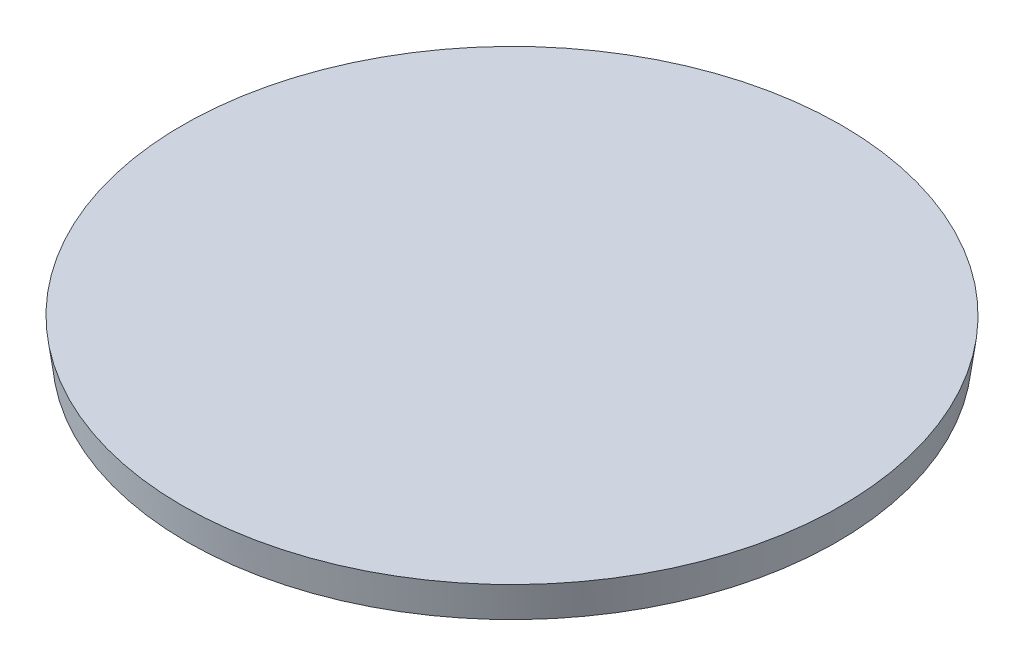
ISO-10303-21;
HEADER;
FILE_DESCRIPTION(('STEP AP214'),'2;1');
FILE_NAME('part.step','',(''),(''),'','','');
FILE_SCHEMA(('AUTOMOTIVE_DESIGN { 1 0 10303 214 1 1 1 1 }'));
ENDSEC;
DATA;
#1=APPLICATION_CONTEXT('core data for automotive mechanical design processes');
#2=APPLICATION_PROTOCOL_DEFINITION('international standard','automotive_design',2000,#1);
#3=PRODUCT_CONTEXT('',#1,'mechanical');
#4=PRODUCT('Part','Part','',(#3));
#5=PRODUCT_RELATED_PRODUCT_CATEGORY('part','',(#4));
#6=PRODUCT_DEFINITION_FORMATION('','',#4);
#7=PRODUCT_DEFINITION_CONTEXT('part definition',#1,'design');
#8=PRODUCT_DEFINITION('design','',#6,#7);
#9=PRODUCT_DEFINITION_SHAPE('','',#8);
#10=(LENGTH_UNIT() NAMED_UNIT(*) SI_UNIT(.MILLI.,.METRE.));
#11=(NAMED_UNIT(*) PLANE_ANGLE_UNIT() SI_UNIT($,.RADIAN.));
#12=(NAMED_UNIT(*) SI_UNIT($,.STERADIAN.) SOLID_ANGLE_UNIT());
#13=UNCERTAINTY_MEASURE_WITH_UNIT(LENGTH_MEASURE(1.E-05),#10,'distance_accuracy_value','');
#14=(GEOMETRIC_REPRESENTATION_CONTEXT(3) GLOBAL_UNCERTAINTY_ASSIGNED_CONTEXT((#13)) GLOBAL_UNIT_ASSIGNED_CONTEXT((#10,
#11,#12)) REPRESENTATION_CONTEXT('',''));
#15=CARTESIAN_POINT('',(0.,0.,0.));
#16=DIRECTION('',(0.,0.,1.));
#17=DIRECTION('',(1.,0.,0.));
#18=AXIS2_PLACEMENT_3D('',#15,#16,#17);
#19=CARTESIAN_POINT('',(0.,0.,0.));
#20=DIRECTION('',(0.,1.,0.));
#21=DIRECTION('',(0.,0.,1.));
#22=AXIS2_PLACEMENT_3D('',#19,#20,#21);
#23=PLANE('',#22);
#24=CARTESIAN_POINT('',(0.,0.,0.));
#25=DIRECTION('',(0.,1.,0.));
#26=DIRECTION('',(0.,0.,1.));
#27=AXIS2_PLACEMENT_3D('',#24,#25,#26);
#28=CIRCLE('',#27,14.7955);
#29=CARTESIAN_POINT('',(0.,0.,14.7955));
#30=VERTEX_POINT('',#29);
#31=EDGE_CURVE('E10',#30,#30,#28,.T.);
#32=ORIENTED_EDGE('',*,*,#31,.F.);
#33=EDGE_LOOP('',(#32));
#34=FACE_BOUND('',#33,.T.);
#35=ADVANCED_FACE('F37',(#34),#23,.F.);
#36=CARTESIAN_POINT('',(0.,0.,0.));
#37=DIRECTION('',(0.,1.,0.));
#38=DIRECTION('',(0.,0.,1.));
#39=AXIS2_PLACEMENT_3D('',#36,#37,#38);
#40=CONICAL_SURFACE('',#39,14.7955,0.130899693899568);
#41=CARTESIAN_POINT('',(0.,1.524,0.));
#42=DIRECTION('',(0.,1.,0.));
#43=DIRECTION('',(0.,0.,1.));
#44=AXIS2_PLACEMENT_3D('',#41,#42,#43);
#45=CIRCLE('',#44,14.9961384063232);
#46=CARTESIAN_POINT('',(0.,1.524,14.9961384063232));
#47=VERTEX_POINT('',#46);
#48=EDGE_CURVE('E43',#47,#47,#45,.T.);
#49=ORIENTED_EDGE('',*,*,#48,.F.);
#50=EDGE_LOOP('',(#49));
#51=FACE_BOUND('',#50,.T.);
#52=ORIENTED_EDGE('',*,*,#31,.T.);
#53=EDGE_LOOP('',(#52));
#54=FACE_BOUND('',#53,.T.);
#55=ADVANCED_FACE('F51',(#51,#54),#40,.T.);
#56=CARTESIAN_POINT('',(14.9961384063232,1.524,0.));
#57=DIRECTION('',(0.,-1.,0.));
#58=DIRECTION('',(0.,0.,-1.));
#59=AXIS2_PLACEMENT_3D('',#56,#57,#58);
#60=PLANE('',#59);
#61=ORIENTED_EDGE('',*,*,#48,.T.);
#62=EDGE_LOOP('',(#61));
#63=FACE_BOUND('',#62,.T.);
#64=ADVANCED_FACE('F49',(#63),#60,.F.);
#65=CLOSED_SHELL('',(#35,#55,#64));
#66=MANIFOLD_SOLID_BREP('B2',#65);
#67=ADVANCED_BREP_SHAPE_REPRESENTATION('',(#18,#66),#14);
#68=SHAPE_DEFINITION_REPRESENTATION(#9,#67);
ENDSEC;
END-ISO-10303-21;
